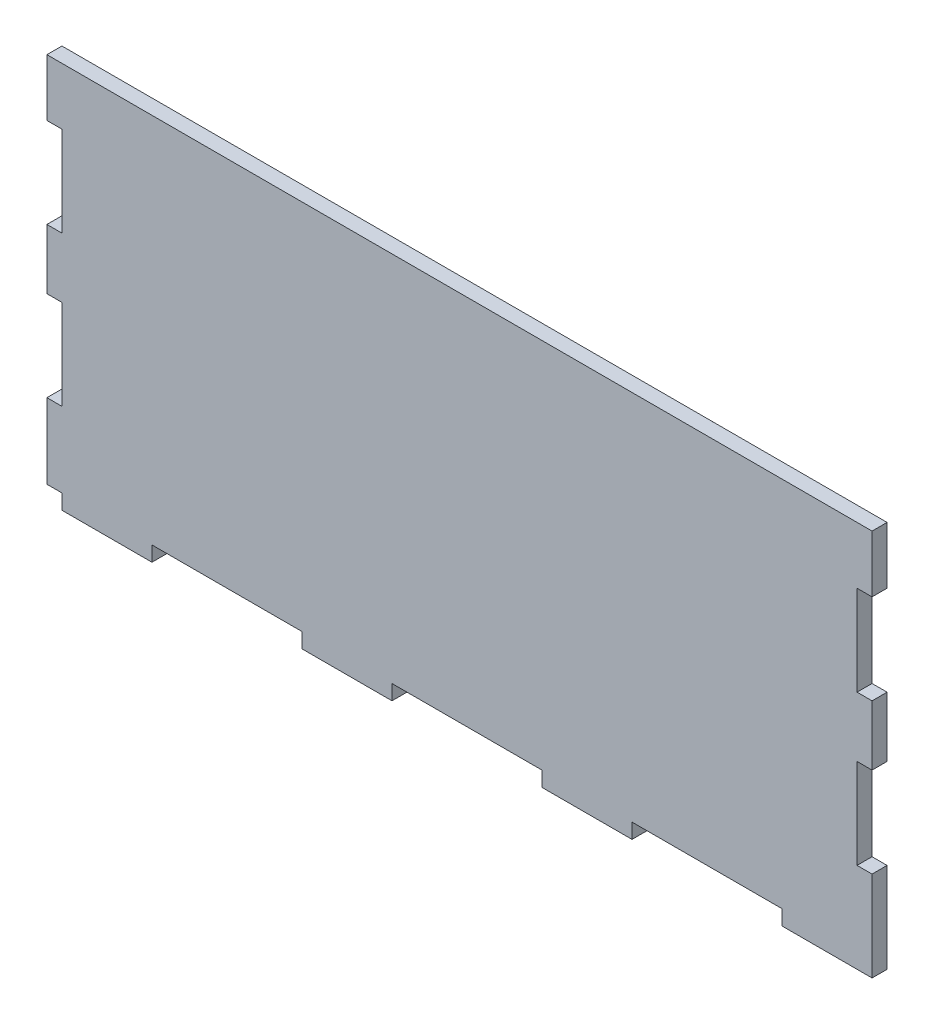
ISO-10303-21;
HEADER;
FILE_DESCRIPTION(('STEP AP214'),'2;1');
FILE_NAME('part.step','',(''),(''),'','','');
FILE_SCHEMA(('AUTOMOTIVE_DESIGN { 1 0 10303 214 1 1 1 1 }'));
ENDSEC;
DATA;
#1=APPLICATION_CONTEXT('core data for automotive mechanical design processes');
#2=APPLICATION_PROTOCOL_DEFINITION('international standard','automotive_design',2000,#1);
#3=PRODUCT_CONTEXT('',#1,'mechanical');
#4=PRODUCT('Part','Part','',(#3));
#5=PRODUCT_RELATED_PRODUCT_CATEGORY('part','',(#4));
#6=PRODUCT_DEFINITION_FORMATION('','',#4);
#7=PRODUCT_DEFINITION_CONTEXT('part definition',#1,'design');
#8=PRODUCT_DEFINITION('design','',#6,#7);
#9=PRODUCT_DEFINITION_SHAPE('','',#8);
#10=(LENGTH_UNIT() NAMED_UNIT(*) SI_UNIT(.MILLI.,.METRE.));
#11=(NAMED_UNIT(*) PLANE_ANGLE_UNIT() SI_UNIT($,.RADIAN.));
#12=(NAMED_UNIT(*) SI_UNIT($,.STERADIAN.) SOLID_ANGLE_UNIT());
#13=UNCERTAINTY_MEASURE_WITH_UNIT(LENGTH_MEASURE(1.E-05),#10,'distance_accuracy_value','');
#14=(GEOMETRIC_REPRESENTATION_CONTEXT(3) GLOBAL_UNCERTAINTY_ASSIGNED_CONTEXT((#13)) GLOBAL_UNIT_ASSIGNED_CONTEXT((#10,
#11,#12)) REPRESENTATION_CONTEXT('',''));
#15=CARTESIAN_POINT('',(0.,0.,0.));
#16=DIRECTION('',(0.,0.,1.));
#17=DIRECTION('',(1.,0.,0.));
#18=AXIS2_PLACEMENT_3D('',#15,#16,#17);
#19=CARTESIAN_POINT('',(180.,0.,5.));
#20=DIRECTION('',(-1.,0.,0.));
#21=DIRECTION('',(0.,0.,1.));
#22=AXIS2_PLACEMENT_3D('',#19,#20,#21);
#23=PLANE('',#22);
#24=DIRECTION('',(0.,1.,0.));
#25=VECTOR('',#24,1.);
#26=CARTESIAN_POINT('',(180.,0.,0.));
#27=LINE('',#26,#25);
#28=CARTESIAN_POINT('',(180.,-49.0000000000001,0.));
#29=VERTEX_POINT('',#28);
#30=CARTESIAN_POINT('',(180.,-19.0000000000001,0.));
#31=VERTEX_POINT('',#30);
#32=EDGE_CURVE('E300',#29,#31,#27,.T.);
#33=ORIENTED_EDGE('',*,*,#32,.F.);
#34=DIRECTION('',(0.,0.,-1.));
#35=VECTOR('',#34,1.);
#36=CARTESIAN_POINT('',(180.,-49.0000000000001,5.));
#37=LINE('',#36,#35);
#38=CARTESIAN_POINT('',(180.,-49.0000000000001,5.));
#39=VERTEX_POINT('',#38);
#40=EDGE_CURVE('E11',#39,#29,#37,.T.);
#41=ORIENTED_EDGE('',*,*,#40,.F.);
#42=DIRECTION('',(0.,1.,0.));
#43=VECTOR('',#42,1.);
#44=CARTESIAN_POINT('',(180.,0.,5.));
#45=LINE('',#44,#43);
#46=CARTESIAN_POINT('',(180.,-19.0000000000001,5.));
#47=VERTEX_POINT('',#46);
#48=EDGE_CURVE('E415',#39,#47,#45,.T.);
#49=ORIENTED_EDGE('',*,*,#48,.T.);
#50=DIRECTION('',(0.,0.,-1.));
#51=VECTOR('',#50,1.);
#52=CARTESIAN_POINT('',(180.,-19.0000000000001,5.));
#53=LINE('',#52,#51);
#54=EDGE_CURVE('E62',#47,#31,#53,.T.);
#55=ORIENTED_EDGE('',*,*,#54,.T.);
#56=EDGE_LOOP('',(#33,#41,#49,#55));
#57=FACE_BOUND('',#56,.T.);
#58=ADVANCED_FACE('F45',(#57),#23,.T.);
#59=CARTESIAN_POINT('',(0.,-49.0000000000001,5.));
#60=DIRECTION('',(0.,-1.,0.));
#61=DIRECTION('',(0.,0.,-1.));
#62=AXIS2_PLACEMENT_3D('',#59,#60,#61);
#63=PLANE('',#62);
#64=DIRECTION('',(-1.,0.,0.));
#65=VECTOR('',#64,1.);
#66=CARTESIAN_POINT('',(0.,-49.0000000000001,0.));
#67=LINE('',#66,#65);
#68=CARTESIAN_POINT('',(175.,-49.0000000000001,0.));
#69=VERTEX_POINT('',#68);
#70=EDGE_CURVE('E303',#29,#69,#67,.T.);
#71=ORIENTED_EDGE('',*,*,#70,.T.);
#72=DIRECTION('',(0.,0.,-1.));
#73=VECTOR('',#72,1.);
#74=CARTESIAN_POINT('',(175.,-49.0000000000001,5.));
#75=LINE('',#74,#73);
#76=CARTESIAN_POINT('',(175.,-49.0000000000001,5.));
#77=VERTEX_POINT('',#76);
#78=EDGE_CURVE('E54',#77,#69,#75,.T.);
#79=ORIENTED_EDGE('',*,*,#78,.F.);
#80=DIRECTION('',(-1.,0.,0.));
#81=VECTOR('',#80,1.);
#82=CARTESIAN_POINT('',(0.,-49.0000000000001,5.));
#83=LINE('',#82,#81);
#84=EDGE_CURVE('E545',#39,#77,#83,.T.);
#85=ORIENTED_EDGE('',*,*,#84,.F.);
#86=ORIENTED_EDGE('',*,*,#40,.T.);
#87=EDGE_LOOP('',(#71,#79,#85,#86));
#88=FACE_BOUND('',#87,.T.);
#89=ADVANCED_FACE('F532',(#88),#63,.F.);
#90=CARTESIAN_POINT('',(175.,0.,5.));
#91=DIRECTION('',(-1.,0.,0.));
#92=DIRECTION('',(0.,0.,1.));
#93=AXIS2_PLACEMENT_3D('',#90,#91,#92);
#94=PLANE('',#93);
#95=DIRECTION('',(0.,1.,0.));
#96=VECTOR('',#95,1.);
#97=CARTESIAN_POINT('',(175.,0.,0.));
#98=LINE('',#97,#96);
#99=CARTESIAN_POINT('',(175.,-69.0000000000001,0.));
#100=VERTEX_POINT('',#99);
#101=EDGE_CURVE('E307',#100,#69,#98,.T.);
#102=ORIENTED_EDGE('',*,*,#101,.F.);
#103=DIRECTION('',(0.,0.,-1.));
#104=VECTOR('',#103,1.);
#105=CARTESIAN_POINT('',(175.,-69.0000000000001,5.));
#106=LINE('',#105,#104);
#107=CARTESIAN_POINT('',(175.,-69.0000000000001,5.));
#108=VERTEX_POINT('',#107);
#109=EDGE_CURVE('E520',#108,#100,#106,.T.);
#110=ORIENTED_EDGE('',*,*,#109,.F.);
#111=DIRECTION('',(0.,1.,0.));
#112=VECTOR('',#111,1.);
#113=CARTESIAN_POINT('',(175.,0.,5.));
#114=LINE('',#113,#112);
#115=EDGE_CURVE('E529',#108,#77,#114,.T.);
#116=ORIENTED_EDGE('',*,*,#115,.T.);
#117=ORIENTED_EDGE('',*,*,#78,.T.);
#118=EDGE_LOOP('',(#102,#110,#116,#117));
#119=FACE_BOUND('',#118,.T.);
#120=ADVANCED_FACE('F527',(#119),#94,.T.);
#121=CARTESIAN_POINT('',(0.,-69.0000000000001,5.));
#122=DIRECTION('',(0.,-1.,0.));
#123=DIRECTION('',(0.,0.,-1.));
#124=AXIS2_PLACEMENT_3D('',#121,#122,#123);
#125=PLANE('',#124);
#126=DIRECTION('',(-1.,0.,0.));
#127=VECTOR('',#126,1.);
#128=CARTESIAN_POINT('',(0.,-69.0000000000001,0.));
#129=LINE('',#128,#127);
#130=CARTESIAN_POINT('',(180.,-69.0000000000001,0.));
#131=VERTEX_POINT('',#130);
#132=EDGE_CURVE('E311',#131,#100,#129,.T.);
#133=ORIENTED_EDGE('',*,*,#132,.F.);
#134=DIRECTION('',(0.,0.,-1.));
#135=VECTOR('',#134,1.);
#136=CARTESIAN_POINT('',(180.,-69.0000000000001,5.));
#137=LINE('',#136,#135);
#138=CARTESIAN_POINT('',(180.,-69.0000000000001,5.));
#139=VERTEX_POINT('',#138);
#140=EDGE_CURVE('E517',#139,#131,#137,.T.);
#141=ORIENTED_EDGE('',*,*,#140,.F.);
#142=DIRECTION('',(-1.,0.,0.));
#143=VECTOR('',#142,1.);
#144=CARTESIAN_POINT('',(0.,-69.0000000000001,5.));
#145=LINE('',#144,#143);
#146=EDGE_CURVE('E542',#139,#108,#145,.T.);
#147=ORIENTED_EDGE('',*,*,#146,.T.);
#148=ORIENTED_EDGE('',*,*,#109,.T.);
#149=EDGE_LOOP('',(#133,#141,#147,#148));
#150=FACE_BOUND('',#149,.T.);
#151=ADVANCED_FACE('F539',(#150),#125,.T.);
#152=CARTESIAN_POINT('',(179.999999999998,4.32986979603806E-12,5.));
#153=DIRECTION('',(-1.,0.,0.));
#154=DIRECTION('',(0.,-1.,0.));
#155=AXIS2_PLACEMENT_3D('',#152,#153,#154);
#156=PLANE('',#155);
#157=DIRECTION('',(0.,1.,0.));
#158=VECTOR('',#157,1.);
#159=CARTESIAN_POINT('',(179.999999999998,4.32986979603806E-12,0.));
#160=LINE('',#159,#158);
#161=CARTESIAN_POINT('',(180.,-99.0000000000001,0.));
#162=VERTEX_POINT('',#161);
#163=EDGE_CURVE('E315',#162,#131,#160,.T.);
#164=ORIENTED_EDGE('',*,*,#163,.F.);
#165=DIRECTION('',(0.,0.,-1.));
#166=VECTOR('',#165,1.);
#167=CARTESIAN_POINT('',(180.,-99.0000000000001,5.));
#168=LINE('',#167,#166);
#169=CARTESIAN_POINT('',(180.,-99.0000000000001,5.));
#170=VERTEX_POINT('',#169);
#171=EDGE_CURVE('E514',#170,#162,#168,.T.);
#172=ORIENTED_EDGE('',*,*,#171,.F.);
#173=DIRECTION('',(0.,1.,0.));
#174=VECTOR('',#173,1.);
#175=CARTESIAN_POINT('',(179.999999999998,4.32986979603806E-12,5.));
#176=LINE('',#175,#174);
#177=EDGE_CURVE('E550',#170,#139,#176,.T.);
#178=ORIENTED_EDGE('',*,*,#177,.T.);
#179=ORIENTED_EDGE('',*,*,#140,.T.);
#180=EDGE_LOOP('',(#164,#172,#178,#179));
#181=FACE_BOUND('',#180,.T.);
#182=ADVANCED_FACE('F662',(#181),#156,.T.);
#183=CARTESIAN_POINT('',(0.,-99.0000000000001,5.));
#184=DIRECTION('',(0.,-1.,0.));
#185=DIRECTION('',(0.,0.,-1.));
#186=AXIS2_PLACEMENT_3D('',#183,#184,#185);
#187=PLANE('',#186);
#188=DIRECTION('',(-1.,0.,0.));
#189=VECTOR('',#188,1.);
#190=CARTESIAN_POINT('',(0.,-99.0000000000001,0.));
#191=LINE('',#190,#189);
#192=CARTESIAN_POINT('',(175.,-99.0000000000001,0.));
#193=VERTEX_POINT('',#192);
#194=EDGE_CURVE('E319',#162,#193,#191,.T.);
#195=ORIENTED_EDGE('',*,*,#194,.T.);
#196=DIRECTION('',(0.,0.,-1.));
#197=VECTOR('',#196,1.);
#198=CARTESIAN_POINT('',(175.,-99.0000000000001,5.));
#199=LINE('',#198,#197);
#200=CARTESIAN_POINT('',(175.,-99.0000000000001,5.));
#201=VERTEX_POINT('',#200);
#202=EDGE_CURVE('E511',#201,#193,#199,.T.);
#203=ORIENTED_EDGE('',*,*,#202,.F.);
#204=DIRECTION('',(-1.,0.,0.));
#205=VECTOR('',#204,1.);
#206=CARTESIAN_POINT('',(0.,-99.0000000000001,5.));
#207=LINE('',#206,#205);
#208=EDGE_CURVE('E557',#170,#201,#207,.T.);
#209=ORIENTED_EDGE('',*,*,#208,.F.);
#210=ORIENTED_EDGE('',*,*,#171,.T.);
#211=EDGE_LOOP('',(#195,#203,#209,#210));
#212=FACE_BOUND('',#211,.T.);
#213=ADVANCED_FACE('F665',(#212),#187,.F.);
#214=CARTESIAN_POINT('',(175.,0.,5.));
#215=DIRECTION('',(-1.,0.,0.));
#216=DIRECTION('',(0.,0.,1.));
#217=AXIS2_PLACEMENT_3D('',#214,#215,#216);
#218=PLANE('',#217);
#219=DIRECTION('',(0.,1.,0.));
#220=VECTOR('',#219,1.);
#221=CARTESIAN_POINT('',(175.,0.,0.));
#222=LINE('',#221,#220);
#223=CARTESIAN_POINT('',(175.,-124.,0.));
#224=VERTEX_POINT('',#223);
#225=EDGE_CURVE('E323',#224,#193,#222,.T.);
#226=ORIENTED_EDGE('',*,*,#225,.F.);
#227=DIRECTION('',(0.,0.,-1.));
#228=VECTOR('',#227,1.);
#229=CARTESIAN_POINT('',(175.,-124.,5.));
#230=LINE('',#229,#228);
#231=CARTESIAN_POINT('',(175.,-124.,5.));
#232=VERTEX_POINT('',#231);
#233=EDGE_CURVE('E508',#232,#224,#230,.T.);
#234=ORIENTED_EDGE('',*,*,#233,.F.);
#235=DIRECTION('',(0.,1.,0.));
#236=VECTOR('',#235,1.);
#237=CARTESIAN_POINT('',(175.,0.,5.));
#238=LINE('',#237,#236);
#239=EDGE_CURVE('E560',#232,#201,#238,.T.);
#240=ORIENTED_EDGE('',*,*,#239,.T.);
#241=ORIENTED_EDGE('',*,*,#202,.T.);
#242=EDGE_LOOP('',(#226,#234,#240,#241));
#243=FACE_BOUND('',#242,.T.);
#244=ADVANCED_FACE('F669',(#243),#218,.T.);
#245=CARTESIAN_POINT('',(-3.44169137633797E-13,-124.,5.));
#246=DIRECTION('',(0.,-1.,0.));
#247=DIRECTION('',(1.,0.,0.));
#248=AXIS2_PLACEMENT_3D('',#245,#246,#247);
#249=PLANE('',#248);
#250=DIRECTION('',(-1.,0.,0.));
#251=VECTOR('',#250,1.);
#252=CARTESIAN_POINT('',(-3.44169137633797E-13,-124.,0.));
#253=LINE('',#252,#251);
#254=CARTESIAN_POINT('',(180.,-124.,0.));
#255=VERTEX_POINT('',#254);
#256=EDGE_CURVE('E327',#255,#224,#253,.T.);
#257=ORIENTED_EDGE('',*,*,#256,.F.);
#258=DIRECTION('',(0.,0.,-1.));
#259=VECTOR('',#258,1.);
#260=CARTESIAN_POINT('',(180.,-124.,5.));
#261=LINE('',#260,#259);
#262=CARTESIAN_POINT('',(180.,-124.,5.));
#263=VERTEX_POINT('',#262);
#264=EDGE_CURVE('E505',#263,#255,#261,.T.);
#265=ORIENTED_EDGE('',*,*,#264,.F.);
#266=DIRECTION('',(-1.,0.,0.));
#267=VECTOR('',#266,1.);
#268=CARTESIAN_POINT('',(-3.44169137633797E-13,-124.,5.));
#269=LINE('',#268,#267);
#270=EDGE_CURVE('E564',#263,#232,#269,.T.);
#271=ORIENTED_EDGE('',*,*,#270,.T.);
#272=ORIENTED_EDGE('',*,*,#233,.T.);
#273=EDGE_LOOP('',(#257,#265,#271,#272));
#274=FACE_BOUND('',#273,.T.);
#275=ADVANCED_FACE('F673',(#274),#249,.T.);
#276=CARTESIAN_POINT('',(180.,0.,5.));
#277=DIRECTION('',(1.,0.,0.));
#278=DIRECTION('',(0.,0.,-1.));
#279=AXIS2_PLACEMENT_3D('',#276,#277,#278);
#280=PLANE('',#279);
#281=DIRECTION('',(0.,-1.,0.));
#282=VECTOR('',#281,1.);
#283=CARTESIAN_POINT('',(180.,0.,0.));
#284=LINE('',#283,#282);
#285=CARTESIAN_POINT('',(180.,-129.,0.));
#286=VERTEX_POINT('',#285);
#287=EDGE_CURVE('E331',#255,#286,#284,.T.);
#288=ORIENTED_EDGE('',*,*,#287,.T.);
#289=DIRECTION('',(0.,0.,-1.));
#290=VECTOR('',#289,1.);
#291=CARTESIAN_POINT('',(180.,-129.,5.));
#292=LINE('',#291,#290);
#293=CARTESIAN_POINT('',(180.,-129.,5.));
#294=VERTEX_POINT('',#293);
#295=EDGE_CURVE('E501',#294,#286,#292,.T.);
#296=ORIENTED_EDGE('',*,*,#295,.F.);
#297=DIRECTION('',(0.,-1.,0.));
#298=VECTOR('',#297,1.);
#299=CARTESIAN_POINT('',(180.,0.,5.));
#300=LINE('',#299,#298);
#301=EDGE_CURVE('E568',#263,#294,#300,.T.);
#302=ORIENTED_EDGE('',*,*,#301,.F.);
#303=ORIENTED_EDGE('',*,*,#264,.T.);
#304=EDGE_LOOP('',(#288,#296,#302,#303));
#305=FACE_BOUND('',#304,.T.);
#306=ADVANCED_FACE('F677',(#305),#280,.F.);
#307=CARTESIAN_POINT('',(0.,-129.,5.));
#308=DIRECTION('',(0.,1.,0.));
#309=DIRECTION('',(0.,0.,1.));
#310=AXIS2_PLACEMENT_3D('',#307,#308,#309);
#311=PLANE('',#310);
#312=DIRECTION('',(1.,0.,0.));
#313=VECTOR('',#312,1.);
#314=CARTESIAN_POINT('',(0.,-129.,0.));
#315=LINE('',#314,#313);
#316=CARTESIAN_POINT('',(210.,-129.,0.));
#317=VERTEX_POINT('',#316);
#318=EDGE_CURVE('E334',#286,#317,#315,.T.);
#319=ORIENTED_EDGE('',*,*,#318,.T.);
#320=DIRECTION('',(0.,0.,-1.));
#321=VECTOR('',#320,1.);
#322=CARTESIAN_POINT('',(210.,-129.,5.));
#323=LINE('',#322,#321);
#324=CARTESIAN_POINT('',(210.,-129.,5.));
#325=VERTEX_POINT('',#324);
#326=EDGE_CURVE('E497',#325,#317,#323,.T.);
#327=ORIENTED_EDGE('',*,*,#326,.F.);
#328=DIRECTION('',(1.,0.,0.));
#329=VECTOR('',#328,1.);
#330=CARTESIAN_POINT('',(0.,-129.,5.));
#331=LINE('',#330,#329);
#332=EDGE_CURVE('E571',#294,#325,#331,.T.);
#333=ORIENTED_EDGE('',*,*,#332,.F.);
#334=ORIENTED_EDGE('',*,*,#295,.T.);
#335=EDGE_LOOP('',(#319,#327,#333,#334));
#336=FACE_BOUND('',#335,.T.);
#337=ADVANCED_FACE('F681',(#336),#311,.F.);
#338=CARTESIAN_POINT('',(210.,0.,5.));
#339=DIRECTION('',(-1.,0.,0.));
#340=DIRECTION('',(0.,0.,1.));
#341=AXIS2_PLACEMENT_3D('',#338,#339,#340);
#342=PLANE('',#341);
#343=DIRECTION('',(0.,1.,0.));
#344=VECTOR('',#343,1.);
#345=CARTESIAN_POINT('',(210.,0.,0.));
#346=LINE('',#345,#344);
#347=CARTESIAN_POINT('',(210.,-124.,0.));
#348=VERTEX_POINT('',#347);
#349=EDGE_CURVE('E337',#317,#348,#346,.T.);
#350=ORIENTED_EDGE('',*,*,#349,.T.);
#351=DIRECTION('',(0.,0.,-1.));
#352=VECTOR('',#351,1.);
#353=CARTESIAN_POINT('',(210.,-124.,5.));
#354=LINE('',#353,#352);
#355=CARTESIAN_POINT('',(210.,-124.,5.));
#356=VERTEX_POINT('',#355);
#357=EDGE_CURVE('E493',#356,#348,#354,.T.);
#358=ORIENTED_EDGE('',*,*,#357,.F.);
#359=DIRECTION('',(0.,1.,0.));
#360=VECTOR('',#359,1.);
#361=CARTESIAN_POINT('',(210.,0.,5.));
#362=LINE('',#361,#360);
#363=EDGE_CURVE('E574',#325,#356,#362,.T.);
#364=ORIENTED_EDGE('',*,*,#363,.F.);
#365=ORIENTED_EDGE('',*,*,#326,.T.);
#366=EDGE_LOOP('',(#350,#358,#364,#365));
#367=FACE_BOUND('',#366,.T.);
#368=ADVANCED_FACE('F685',(#367),#342,.F.);
#369=CARTESIAN_POINT('',(0.,-124.,5.));
#370=DIRECTION('',(0.,1.,0.));
#371=DIRECTION('',(0.,0.,1.));
#372=AXIS2_PLACEMENT_3D('',#369,#370,#371);
#373=PLANE('',#372);
#374=DIRECTION('',(1.,0.,0.));
#375=VECTOR('',#374,1.);
#376=CARTESIAN_POINT('',(0.,-124.,0.));
#377=LINE('',#376,#375);
#378=CARTESIAN_POINT('',(260.,-124.,0.));
#379=VERTEX_POINT('',#378);
#380=EDGE_CURVE('E340',#348,#379,#377,.T.);
#381=ORIENTED_EDGE('',*,*,#380,.T.);
#382=DIRECTION('',(0.,0.,-1.));
#383=VECTOR('',#382,1.);
#384=CARTESIAN_POINT('',(260.,-124.,5.));
#385=LINE('',#384,#383);
#386=CARTESIAN_POINT('',(260.,-124.,5.));
#387=VERTEX_POINT('',#386);
#388=EDGE_CURVE('E489',#387,#379,#385,.T.);
#389=ORIENTED_EDGE('',*,*,#388,.F.);
#390=DIRECTION('',(1.,0.,0.));
#391=VECTOR('',#390,1.);
#392=CARTESIAN_POINT('',(0.,-124.,5.));
#393=LINE('',#392,#391);
#394=EDGE_CURVE('E577',#356,#387,#393,.T.);
#395=ORIENTED_EDGE('',*,*,#394,.F.);
#396=ORIENTED_EDGE('',*,*,#357,.T.);
#397=EDGE_LOOP('',(#381,#389,#395,#396));
#398=FACE_BOUND('',#397,.T.);
#399=ADVANCED_FACE('F689',(#398),#373,.F.);
#400=CARTESIAN_POINT('',(260.,0.,5.));
#401=DIRECTION('',(1.,0.,0.));
#402=DIRECTION('',(0.,0.,-1.));
#403=AXIS2_PLACEMENT_3D('',#400,#401,#402);
#404=PLANE('',#403);
#405=DIRECTION('',(0.,-1.,0.));
#406=VECTOR('',#405,1.);
#407=CARTESIAN_POINT('',(260.,0.,0.));
#408=LINE('',#407,#406);
#409=CARTESIAN_POINT('',(260.,-129.,0.));
#410=VERTEX_POINT('',#409);
#411=EDGE_CURVE('E343',#379,#410,#408,.T.);
#412=ORIENTED_EDGE('',*,*,#411,.T.);
#413=DIRECTION('',(0.,0.,-1.));
#414=VECTOR('',#413,1.);
#415=CARTESIAN_POINT('',(260.,-129.,5.));
#416=LINE('',#415,#414);
#417=CARTESIAN_POINT('',(260.,-129.,5.));
#418=VERTEX_POINT('',#417);
#419=EDGE_CURVE('E485',#418,#410,#416,.T.);
#420=ORIENTED_EDGE('',*,*,#419,.F.);
#421=DIRECTION('',(0.,-1.,0.));
#422=VECTOR('',#421,1.);
#423=CARTESIAN_POINT('',(260.,0.,5.));
#424=LINE('',#423,#422);
#425=EDGE_CURVE('E580',#387,#418,#424,.T.);
#426=ORIENTED_EDGE('',*,*,#425,.F.);
#427=ORIENTED_EDGE('',*,*,#388,.T.);
#428=EDGE_LOOP('',(#412,#420,#426,#427));
#429=FACE_BOUND('',#428,.T.);
#430=ADVANCED_FACE('F693',(#429),#404,.F.);
#431=CARTESIAN_POINT('',(0.,-129.,5.));
#432=DIRECTION('',(0.,1.,0.));
#433=DIRECTION('',(0.,0.,1.));
#434=AXIS2_PLACEMENT_3D('',#431,#432,#433);
#435=PLANE('',#434);
#436=DIRECTION('',(1.,0.,0.));
#437=VECTOR('',#436,1.);
#438=CARTESIAN_POINT('',(0.,-129.,0.));
#439=LINE('',#438,#437);
#440=CARTESIAN_POINT('',(290.,-129.,0.));
#441=VERTEX_POINT('',#440);
#442=EDGE_CURVE('E346',#410,#441,#439,.T.);
#443=ORIENTED_EDGE('',*,*,#442,.T.);
#444=DIRECTION('',(0.,0.,-1.));
#445=VECTOR('',#444,1.);
#446=CARTESIAN_POINT('',(290.,-129.,5.));
#447=LINE('',#446,#445);
#448=CARTESIAN_POINT('',(290.,-129.,5.));
#449=VERTEX_POINT('',#448);
#450=EDGE_CURVE('E481',#449,#441,#447,.T.);
#451=ORIENTED_EDGE('',*,*,#450,.F.);
#452=DIRECTION('',(1.,0.,0.));
#453=VECTOR('',#452,1.);
#454=CARTESIAN_POINT('',(0.,-129.,5.));
#455=LINE('',#454,#453);
#456=EDGE_CURVE('E583',#418,#449,#455,.T.);
#457=ORIENTED_EDGE('',*,*,#456,.F.);
#458=ORIENTED_EDGE('',*,*,#419,.T.);
#459=EDGE_LOOP('',(#443,#451,#457,#458));
#460=FACE_BOUND('',#459,.T.);
#461=ADVANCED_FACE('F697',(#460),#435,.F.);
#462=CARTESIAN_POINT('',(290.,0.,5.));
#463=DIRECTION('',(-1.,0.,0.));
#464=DIRECTION('',(0.,0.,1.));
#465=AXIS2_PLACEMENT_3D('',#462,#463,#464);
#466=PLANE('',#465);
#467=DIRECTION('',(0.,1.,0.));
#468=VECTOR('',#467,1.);
#469=CARTESIAN_POINT('',(290.,0.,0.));
#470=LINE('',#469,#468);
#471=CARTESIAN_POINT('',(290.,-124.,0.));
#472=VERTEX_POINT('',#471);
#473=EDGE_CURVE('E349',#441,#472,#470,.T.);
#474=ORIENTED_EDGE('',*,*,#473,.T.);
#475=DIRECTION('',(0.,0.,-1.));
#476=VECTOR('',#475,1.);
#477=CARTESIAN_POINT('',(290.,-124.,5.));
#478=LINE('',#477,#476);
#479=CARTESIAN_POINT('',(290.,-124.,5.));
#480=VERTEX_POINT('',#479);
#481=EDGE_CURVE('E477',#480,#472,#478,.T.);
#482=ORIENTED_EDGE('',*,*,#481,.F.);
#483=DIRECTION('',(0.,1.,0.));
#484=VECTOR('',#483,1.);
#485=CARTESIAN_POINT('',(290.,0.,5.));
#486=LINE('',#485,#484);
#487=EDGE_CURVE('E586',#449,#480,#486,.T.);
#488=ORIENTED_EDGE('',*,*,#487,.F.);
#489=ORIENTED_EDGE('',*,*,#450,.T.);
#490=EDGE_LOOP('',(#474,#482,#488,#489));
#491=FACE_BOUND('',#490,.T.);
#492=ADVANCED_FACE('F701',(#491),#466,.F.);
#493=CARTESIAN_POINT('',(0.,-124.,5.));
#494=DIRECTION('',(0.,1.,0.));
#495=DIRECTION('',(0.,0.,1.));
#496=AXIS2_PLACEMENT_3D('',#493,#494,#495);
#497=PLANE('',#496);
#498=DIRECTION('',(1.,0.,0.));
#499=VECTOR('',#498,1.);
#500=CARTESIAN_POINT('',(0.,-124.,0.));
#501=LINE('',#500,#499);
#502=CARTESIAN_POINT('',(340.,-124.,0.));
#503=VERTEX_POINT('',#502);
#504=EDGE_CURVE('E352',#472,#503,#501,.T.);
#505=ORIENTED_EDGE('',*,*,#504,.T.);
#506=DIRECTION('',(0.,0.,-1.));
#507=VECTOR('',#506,1.);
#508=CARTESIAN_POINT('',(340.,-124.,5.));
#509=LINE('',#508,#507);
#510=CARTESIAN_POINT('',(340.,-124.,5.));
#511=VERTEX_POINT('',#510);
#512=EDGE_CURVE('E473',#511,#503,#509,.T.);
#513=ORIENTED_EDGE('',*,*,#512,.F.);
#514=DIRECTION('',(1.,0.,0.));
#515=VECTOR('',#514,1.);
#516=CARTESIAN_POINT('',(0.,-124.,5.));
#517=LINE('',#516,#515);
#518=EDGE_CURVE('E589',#480,#511,#517,.T.);
#519=ORIENTED_EDGE('',*,*,#518,.F.);
#520=ORIENTED_EDGE('',*,*,#481,.T.);
#521=EDGE_LOOP('',(#505,#513,#519,#520));
#522=FACE_BOUND('',#521,.T.);
#523=ADVANCED_FACE('F705',(#522),#497,.F.);
#524=CARTESIAN_POINT('',(340.,0.,5.));
#525=DIRECTION('',(1.,0.,0.));
#526=DIRECTION('',(0.,0.,-1.));
#527=AXIS2_PLACEMENT_3D('',#524,#525,#526);
#528=PLANE('',#527);
#529=DIRECTION('',(0.,-1.,0.));
#530=VECTOR('',#529,1.);
#531=CARTESIAN_POINT('',(340.,0.,0.));
#532=LINE('',#531,#530);
#533=CARTESIAN_POINT('',(340.,-129.,0.));
#534=VERTEX_POINT('',#533);
#535=EDGE_CURVE('E355',#503,#534,#532,.T.);
#536=ORIENTED_EDGE('',*,*,#535,.T.);
#537=DIRECTION('',(0.,0.,-1.));
#538=VECTOR('',#537,1.);
#539=CARTESIAN_POINT('',(340.,-129.,5.));
#540=LINE('',#539,#538);
#541=CARTESIAN_POINT('',(340.,-129.,5.));
#542=VERTEX_POINT('',#541);
#543=EDGE_CURVE('E469',#542,#534,#540,.T.);
#544=ORIENTED_EDGE('',*,*,#543,.F.);
#545=DIRECTION('',(0.,-1.,0.));
#546=VECTOR('',#545,1.);
#547=CARTESIAN_POINT('',(340.,0.,5.));
#548=LINE('',#547,#546);
#549=EDGE_CURVE('E592',#511,#542,#548,.T.);
#550=ORIENTED_EDGE('',*,*,#549,.F.);
#551=ORIENTED_EDGE('',*,*,#512,.T.);
#552=EDGE_LOOP('',(#536,#544,#550,#551));
#553=FACE_BOUND('',#552,.T.);
#554=ADVANCED_FACE('F709',(#553),#528,.F.);
#555=CARTESIAN_POINT('',(0.,-129.,5.));
#556=DIRECTION('',(0.,1.,0.));
#557=DIRECTION('',(0.,0.,1.));
#558=AXIS2_PLACEMENT_3D('',#555,#556,#557);
#559=PLANE('',#558);
#560=DIRECTION('',(1.,0.,0.));
#561=VECTOR('',#560,1.);
#562=CARTESIAN_POINT('',(0.,-129.,0.));
#563=LINE('',#562,#561);
#564=CARTESIAN_POINT('',(370.,-129.,0.));
#565=VERTEX_POINT('',#564);
#566=EDGE_CURVE('E358',#534,#565,#563,.T.);
#567=ORIENTED_EDGE('',*,*,#566,.T.);
#568=DIRECTION('',(0.,0.,-1.));
#569=VECTOR('',#568,1.);
#570=CARTESIAN_POINT('',(370.,-129.,5.));
#571=LINE('',#570,#569);
#572=CARTESIAN_POINT('',(370.,-129.,5.));
#573=VERTEX_POINT('',#572);
#574=EDGE_CURVE('E465',#573,#565,#571,.T.);
#575=ORIENTED_EDGE('',*,*,#574,.F.);
#576=DIRECTION('',(1.,0.,0.));
#577=VECTOR('',#576,1.);
#578=CARTESIAN_POINT('',(0.,-129.,5.));
#579=LINE('',#578,#577);
#580=EDGE_CURVE('E595',#542,#573,#579,.T.);
#581=ORIENTED_EDGE('',*,*,#580,.F.);
#582=ORIENTED_EDGE('',*,*,#543,.T.);
#583=EDGE_LOOP('',(#567,#575,#581,#582));
#584=FACE_BOUND('',#583,.T.);
#585=ADVANCED_FACE('F713',(#584),#559,.F.);
#586=CARTESIAN_POINT('',(370.,0.,5.));
#587=DIRECTION('',(-1.,0.,0.));
#588=DIRECTION('',(0.,0.,1.));
#589=AXIS2_PLACEMENT_3D('',#586,#587,#588);
#590=PLANE('',#589);
#591=DIRECTION('',(0.,1.,0.));
#592=VECTOR('',#591,1.);
#593=CARTESIAN_POINT('',(370.,0.,0.));
#594=LINE('',#593,#592);
#595=CARTESIAN_POINT('',(370.,-124.,0.));
#596=VERTEX_POINT('',#595);
#597=EDGE_CURVE('E361',#565,#596,#594,.T.);
#598=ORIENTED_EDGE('',*,*,#597,.T.);
#599=DIRECTION('',(0.,0.,-1.));
#600=VECTOR('',#599,1.);
#601=CARTESIAN_POINT('',(370.,-124.,5.));
#602=LINE('',#601,#600);
#603=CARTESIAN_POINT('',(370.,-124.,5.));
#604=VERTEX_POINT('',#603);
#605=EDGE_CURVE('E461',#604,#596,#602,.T.);
#606=ORIENTED_EDGE('',*,*,#605,.F.);
#607=DIRECTION('',(0.,1.,0.));
#608=VECTOR('',#607,1.);
#609=CARTESIAN_POINT('',(370.,0.,5.));
#610=LINE('',#609,#608);
#611=EDGE_CURVE('E598',#573,#604,#610,.T.);
#612=ORIENTED_EDGE('',*,*,#611,.F.);
#613=ORIENTED_EDGE('',*,*,#574,.T.);
#614=EDGE_LOOP('',(#598,#606,#612,#613));
#615=FACE_BOUND('',#614,.T.);
#616=ADVANCED_FACE('F717',(#615),#590,.F.);
#617=CARTESIAN_POINT('',(0.,-124.,5.));
#618=DIRECTION('',(0.,1.,0.));
#619=DIRECTION('',(0.,0.,1.));
#620=AXIS2_PLACEMENT_3D('',#617,#618,#619);
#621=PLANE('',#620);
#622=DIRECTION('',(1.,0.,0.));
#623=VECTOR('',#622,1.);
#624=CARTESIAN_POINT('',(0.,-124.,0.));
#625=LINE('',#624,#623);
#626=CARTESIAN_POINT('',(420.,-124.,0.));
#627=VERTEX_POINT('',#626);
#628=EDGE_CURVE('E364',#596,#627,#625,.T.);
#629=ORIENTED_EDGE('',*,*,#628,.T.);
#630=DIRECTION('',(0.,0.,-1.));
#631=VECTOR('',#630,1.);
#632=CARTESIAN_POINT('',(420.,-124.,5.));
#633=LINE('',#632,#631);
#634=CARTESIAN_POINT('',(420.,-124.,5.));
#635=VERTEX_POINT('',#634);
#636=EDGE_CURVE('E457',#635,#627,#633,.T.);
#637=ORIENTED_EDGE('',*,*,#636,.F.);
#638=DIRECTION('',(1.,0.,0.));
#639=VECTOR('',#638,1.);
#640=CARTESIAN_POINT('',(0.,-124.,5.));
#641=LINE('',#640,#639);
#642=EDGE_CURVE('E601',#604,#635,#641,.T.);
#643=ORIENTED_EDGE('',*,*,#642,.F.);
#644=ORIENTED_EDGE('',*,*,#605,.T.);
#645=EDGE_LOOP('',(#629,#637,#643,#644));
#646=FACE_BOUND('',#645,.T.);
#647=ADVANCED_FACE('F721',(#646),#621,.F.);
#648=CARTESIAN_POINT('',(420.,0.,5.));
#649=DIRECTION('',(1.,0.,0.));
#650=DIRECTION('',(0.,0.,-1.));
#651=AXIS2_PLACEMENT_3D('',#648,#649,#650);
#652=PLANE('',#651);
#653=DIRECTION('',(0.,-1.,0.));
#654=VECTOR('',#653,1.);
#655=CARTESIAN_POINT('',(420.,0.,0.));
#656=LINE('',#655,#654);
#657=CARTESIAN_POINT('',(420.,-129.,0.));
#658=VERTEX_POINT('',#657);
#659=EDGE_CURVE('E367',#627,#658,#656,.T.);
#660=ORIENTED_EDGE('',*,*,#659,.T.);
#661=DIRECTION('',(0.,0.,-1.));
#662=VECTOR('',#661,1.);
#663=CARTESIAN_POINT('',(420.,-129.,5.));
#664=LINE('',#663,#662);
#665=CARTESIAN_POINT('',(420.,-129.,5.));
#666=VERTEX_POINT('',#665);
#667=EDGE_CURVE('E453',#666,#658,#664,.T.);
#668=ORIENTED_EDGE('',*,*,#667,.F.);
#669=DIRECTION('',(0.,-1.,0.));
#670=VECTOR('',#669,1.);
#671=CARTESIAN_POINT('',(420.,0.,5.));
#672=LINE('',#671,#670);
#673=EDGE_CURVE('E604',#635,#666,#672,.T.);
#674=ORIENTED_EDGE('',*,*,#673,.F.);
#675=ORIENTED_EDGE('',*,*,#636,.T.);
#676=EDGE_LOOP('',(#660,#668,#674,#675));
#677=FACE_BOUND('',#676,.T.);
#678=ADVANCED_FACE('F725',(#677),#652,.F.);
#679=CARTESIAN_POINT('',(0.,-129.,5.));
#680=DIRECTION('',(0.,1.,0.));
#681=DIRECTION('',(0.,0.,1.));
#682=AXIS2_PLACEMENT_3D('',#679,#680,#681);
#683=PLANE('',#682);
#684=DIRECTION('',(1.,0.,0.));
#685=VECTOR('',#684,1.);
#686=CARTESIAN_POINT('',(0.,-129.,0.));
#687=LINE('',#686,#685);
#688=CARTESIAN_POINT('',(450.,-129.,0.));
#689=VERTEX_POINT('',#688);
#690=EDGE_CURVE('E370',#658,#689,#687,.T.);
#691=ORIENTED_EDGE('',*,*,#690,.T.);
#692=DIRECTION('',(0.,0.,-1.));
#693=VECTOR('',#692,1.);
#694=CARTESIAN_POINT('',(450.,-129.,5.));
#695=LINE('',#694,#693);
#696=CARTESIAN_POINT('',(450.,-129.,5.));
#697=VERTEX_POINT('',#696);
#698=EDGE_CURVE('E449',#697,#689,#695,.T.);
#699=ORIENTED_EDGE('',*,*,#698,.F.);
#700=DIRECTION('',(1.,0.,0.));
#701=VECTOR('',#700,1.);
#702=CARTESIAN_POINT('',(0.,-129.,5.));
#703=LINE('',#702,#701);
#704=EDGE_CURVE('E607',#666,#697,#703,.T.);
#705=ORIENTED_EDGE('',*,*,#704,.F.);
#706=ORIENTED_EDGE('',*,*,#667,.T.);
#707=EDGE_LOOP('',(#691,#699,#705,#706));
#708=FACE_BOUND('',#707,.T.);
#709=ADVANCED_FACE('F729',(#708),#683,.F.);
#710=CARTESIAN_POINT('',(450.,0.,5.));
#711=DIRECTION('',(-1.,0.,0.));
#712=DIRECTION('',(0.,0.,1.));
#713=AXIS2_PLACEMENT_3D('',#710,#711,#712);
#714=PLANE('',#713);
#715=DIRECTION('',(0.,1.,0.));
#716=VECTOR('',#715,1.);
#717=CARTESIAN_POINT('',(450.,0.,0.));
#718=LINE('',#717,#716);
#719=CARTESIAN_POINT('',(449.999999999994,-99.0000000000001,0.));
#720=VERTEX_POINT('',#719);
#721=EDGE_CURVE('E373',#689,#720,#718,.T.);
#722=ORIENTED_EDGE('',*,*,#721,.T.);
#723=DIRECTION('',(0.,0.,-1.));
#724=VECTOR('',#723,1.);
#725=CARTESIAN_POINT('',(449.999999999994,-99.0000000000001,5.));
#726=LINE('',#725,#724);
#727=CARTESIAN_POINT('',(449.999999999994,-99.0000000000001,5.));
#728=VERTEX_POINT('',#727);
#729=EDGE_CURVE('E445',#728,#720,#726,.T.);
#730=ORIENTED_EDGE('',*,*,#729,.F.);
#731=DIRECTION('',(0.,1.,0.));
#732=VECTOR('',#731,1.);
#733=CARTESIAN_POINT('',(450.,0.,5.));
#734=LINE('',#733,#732);
#735=EDGE_CURVE('E610',#697,#728,#734,.T.);
#736=ORIENTED_EDGE('',*,*,#735,.F.);
#737=ORIENTED_EDGE('',*,*,#698,.T.);
#738=EDGE_LOOP('',(#722,#730,#736,#737));
#739=FACE_BOUND('',#738,.T.);
#740=ADVANCED_FACE('F733',(#739),#714,.F.);
#741=CARTESIAN_POINT('',(0.,-99.0000000000001,5.));
#742=DIRECTION('',(0.,-1.,0.));
#743=DIRECTION('',(0.,0.,-1.));
#744=AXIS2_PLACEMENT_3D('',#741,#742,#743);
#745=PLANE('',#744);
#746=DIRECTION('',(-1.,0.,0.));
#747=VECTOR('',#746,1.);
#748=CARTESIAN_POINT('',(0.,-99.0000000000001,0.));
#749=LINE('',#748,#747);
#750=CARTESIAN_POINT('',(444.999999999994,-99.0000000000001,0.));
#751=VERTEX_POINT('',#750);
#752=EDGE_CURVE('E376',#720,#751,#749,.T.);
#753=ORIENTED_EDGE('',*,*,#752,.T.);
#754=DIRECTION('',(0.,0.,-1.));
#755=VECTOR('',#754,1.);
#756=CARTESIAN_POINT('',(444.999999999994,-99.0000000000001,5.));
#757=LINE('',#756,#755);
#758=CARTESIAN_POINT('',(444.999999999994,-99.0000000000001,5.));
#759=VERTEX_POINT('',#758);
#760=EDGE_CURVE('E441',#759,#751,#757,.T.);
#761=ORIENTED_EDGE('',*,*,#760,.F.);
#762=DIRECTION('',(-1.,0.,0.));
#763=VECTOR('',#762,1.);
#764=CARTESIAN_POINT('',(0.,-99.0000000000001,5.));
#765=LINE('',#764,#763);
#766=EDGE_CURVE('E613',#728,#759,#765,.T.);
#767=ORIENTED_EDGE('',*,*,#766,.F.);
#768=ORIENTED_EDGE('',*,*,#729,.T.);
#769=EDGE_LOOP('',(#753,#761,#767,#768));
#770=FACE_BOUND('',#769,.T.);
#771=ADVANCED_FACE('F737',(#770),#745,.F.);
#772=CARTESIAN_POINT('',(444.999999999994,0.,5.));
#773=DIRECTION('',(-1.,0.,0.));
#774=DIRECTION('',(0.,0.,1.));
#775=AXIS2_PLACEMENT_3D('',#772,#773,#774);
#776=PLANE('',#775);
#777=DIRECTION('',(0.,1.,0.));
#778=VECTOR('',#777,1.);
#779=CARTESIAN_POINT('',(444.999999999994,0.,0.));
#780=LINE('',#779,#778);
#781=CARTESIAN_POINT('',(444.999999999994,-69.0000000000001,0.));
#782=VERTEX_POINT('',#781);
#783=EDGE_CURVE('E379',#751,#782,#780,.T.);
#784=ORIENTED_EDGE('',*,*,#783,.T.);
#785=DIRECTION('',(0.,0.,-1.));
#786=VECTOR('',#785,1.);
#787=CARTESIAN_POINT('',(444.999999999994,-69.0000000000001,5.));
#788=LINE('',#787,#786);
#789=CARTESIAN_POINT('',(444.999999999994,-69.0000000000001,5.));
#790=VERTEX_POINT('',#789);
#791=EDGE_CURVE('E438',#790,#782,#788,.T.);
#792=ORIENTED_EDGE('',*,*,#791,.F.);
#793=DIRECTION('',(0.,1.,0.));
#794=VECTOR('',#793,1.);
#795=CARTESIAN_POINT('',(444.999999999994,0.,5.));
#796=LINE('',#795,#794);
#797=EDGE_CURVE('E616',#759,#790,#796,.T.);
#798=ORIENTED_EDGE('',*,*,#797,.F.);
#799=ORIENTED_EDGE('',*,*,#760,.T.);
#800=EDGE_LOOP('',(#784,#792,#798,#799));
#801=FACE_BOUND('',#800,.T.);
#802=ADVANCED_FACE('F741',(#801),#776,.F.);
#803=CARTESIAN_POINT('',(0.,-69.0000000000001,5.));
#804=DIRECTION('',(0.,-1.,0.));
#805=DIRECTION('',(0.,0.,-1.));
#806=AXIS2_PLACEMENT_3D('',#803,#804,#805);
#807=PLANE('',#806);
#808=DIRECTION('',(-1.,0.,0.));
#809=VECTOR('',#808,1.);
#810=CARTESIAN_POINT('',(0.,-69.0000000000001,0.));
#811=LINE('',#810,#809);
#812=CARTESIAN_POINT('',(449.999999999994,-69.0000000000001,0.));
#813=VERTEX_POINT('',#812);
#814=EDGE_CURVE('E383',#813,#782,#811,.T.);
#815=ORIENTED_EDGE('',*,*,#814,.F.);
#816=DIRECTION('',(0.,0.,-1.));
#817=VECTOR('',#816,1.);
#818=CARTESIAN_POINT('',(449.999999999994,-69.0000000000001,5.));
#819=LINE('',#818,#817);
#820=CARTESIAN_POINT('',(449.999999999994,-69.0000000000001,5.));
#821=VERTEX_POINT('',#820);
#822=EDGE_CURVE('E435',#821,#813,#819,.T.);
#823=ORIENTED_EDGE('',*,*,#822,.F.);
#824=DIRECTION('',(-1.,0.,0.));
#825=VECTOR('',#824,1.);
#826=CARTESIAN_POINT('',(0.,-69.0000000000001,5.));
#827=LINE('',#826,#825);
#828=EDGE_CURVE('E619',#821,#790,#827,.T.);
#829=ORIENTED_EDGE('',*,*,#828,.T.);
#830=ORIENTED_EDGE('',*,*,#791,.T.);
#831=EDGE_LOOP('',(#815,#823,#829,#830));
#832=FACE_BOUND('',#831,.T.);
#833=ADVANCED_FACE('F745',(#832),#807,.T.);
#834=CARTESIAN_POINT('',(449.999999999994,0.,5.));
#835=DIRECTION('',(1.,0.,0.));
#836=DIRECTION('',(0.,0.,-1.));
#837=AXIS2_PLACEMENT_3D('',#834,#835,#836);
#838=PLANE('',#837);
#839=DIRECTION('',(0.,-1.,0.));
#840=VECTOR('',#839,1.);
#841=CARTESIAN_POINT('',(449.999999999994,0.,0.));
#842=LINE('',#841,#840);
#843=CARTESIAN_POINT('',(449.999999999994,-49.0000000000001,0.));
#844=VERTEX_POINT('',#843);
#845=EDGE_CURVE('E387',#844,#813,#842,.T.);
#846=ORIENTED_EDGE('',*,*,#845,.F.);
#847=DIRECTION('',(0.,0.,-1.));
#848=VECTOR('',#847,1.);
#849=CARTESIAN_POINT('',(449.999999999994,-49.0000000000001,5.));
#850=LINE('',#849,#848);
#851=CARTESIAN_POINT('',(449.999999999994,-49.0000000000001,5.));
#852=VERTEX_POINT('',#851);
#853=EDGE_CURVE('E432',#852,#844,#850,.T.);
#854=ORIENTED_EDGE('',*,*,#853,.F.);
#855=DIRECTION('',(0.,-1.,0.));
#856=VECTOR('',#855,1.);
#857=CARTESIAN_POINT('',(449.999999999994,0.,5.));
#858=LINE('',#857,#856);
#859=EDGE_CURVE('E623',#852,#821,#858,.T.);
#860=ORIENTED_EDGE('',*,*,#859,.T.);
#861=ORIENTED_EDGE('',*,*,#822,.T.);
#862=EDGE_LOOP('',(#846,#854,#860,#861));
#863=FACE_BOUND('',#862,.T.);
#864=ADVANCED_FACE('F749',(#863),#838,.T.);
#865=CARTESIAN_POINT('',(0.,-49.0000000000001,5.));
#866=DIRECTION('',(0.,-1.,0.));
#867=DIRECTION('',(0.,0.,-1.));
#868=AXIS2_PLACEMENT_3D('',#865,#866,#867);
#869=PLANE('',#868);
#870=DIRECTION('',(-1.,0.,0.));
#871=VECTOR('',#870,1.);
#872=CARTESIAN_POINT('',(0.,-49.0000000000001,0.));
#873=LINE('',#872,#871);
#874=CARTESIAN_POINT('',(444.999999999994,-49.0000000000001,0.));
#875=VERTEX_POINT('',#874);
#876=EDGE_CURVE('E391',#844,#875,#873,.T.);
#877=ORIENTED_EDGE('',*,*,#876,.T.);
#878=DIRECTION('',(0.,0.,-1.));
#879=VECTOR('',#878,1.);
#880=CARTESIAN_POINT('',(444.999999999994,-49.0000000000001,5.));
#881=LINE('',#880,#879);
#882=CARTESIAN_POINT('',(444.999999999994,-49.0000000000001,5.));
#883=VERTEX_POINT('',#882);
#884=EDGE_CURVE('E428',#883,#875,#881,.T.);
#885=ORIENTED_EDGE('',*,*,#884,.F.);
#886=DIRECTION('',(-1.,0.,0.));
#887=VECTOR('',#886,1.);
#888=CARTESIAN_POINT('',(0.,-49.0000000000001,5.));
#889=LINE('',#888,#887);
#890=EDGE_CURVE('E627',#852,#883,#889,.T.);
#891=ORIENTED_EDGE('',*,*,#890,.F.);
#892=ORIENTED_EDGE('',*,*,#853,.T.);
#893=EDGE_LOOP('',(#877,#885,#891,#892));
#894=FACE_BOUND('',#893,.T.);
#895=ADVANCED_FACE('F753',(#894),#869,.F.);
#896=CARTESIAN_POINT('',(444.999999999994,0.,5.));
#897=DIRECTION('',(-1.,0.,0.));
#898=DIRECTION('',(0.,0.,1.));
#899=AXIS2_PLACEMENT_3D('',#896,#897,#898);
#900=PLANE('',#899);
#901=DIRECTION('',(0.,1.,0.));
#902=VECTOR('',#901,1.);
#903=CARTESIAN_POINT('',(444.999999999994,0.,0.));
#904=LINE('',#903,#902);
#905=CARTESIAN_POINT('',(444.999999999994,-19.0000000000001,0.));
#906=VERTEX_POINT('',#905);
#907=EDGE_CURVE('E394',#875,#906,#904,.T.);
#908=ORIENTED_EDGE('',*,*,#907,.T.);
#909=DIRECTION('',(0.,0.,-1.));
#910=VECTOR('',#909,1.);
#911=CARTESIAN_POINT('',(444.999999999994,-19.0000000000001,5.));
#912=LINE('',#911,#910);
#913=CARTESIAN_POINT('',(444.999999999994,-19.0000000000001,5.));
#914=VERTEX_POINT('',#913);
#915=EDGE_CURVE('E425',#914,#906,#912,.T.);
#916=ORIENTED_EDGE('',*,*,#915,.F.);
#917=DIRECTION('',(0.,1.,0.));
#918=VECTOR('',#917,1.);
#919=CARTESIAN_POINT('',(444.999999999994,0.,5.));
#920=LINE('',#919,#918);
#921=EDGE_CURVE('E630',#883,#914,#920,.T.);
#922=ORIENTED_EDGE('',*,*,#921,.F.);
#923=ORIENTED_EDGE('',*,*,#884,.T.);
#924=EDGE_LOOP('',(#908,#916,#922,#923));
#925=FACE_BOUND('',#924,.T.);
#926=ADVANCED_FACE('F757',(#925),#900,.F.);
#927=CARTESIAN_POINT('',(0.,-19.0000000000001,5.));
#928=DIRECTION('',(0.,-1.,0.));
#929=DIRECTION('',(0.,0.,-1.));
#930=AXIS2_PLACEMENT_3D('',#927,#928,#929);
#931=PLANE('',#930);
#932=DIRECTION('',(-1.,0.,0.));
#933=VECTOR('',#932,1.);
#934=CARTESIAN_POINT('',(0.,-19.0000000000001,0.));
#935=LINE('',#934,#933);
#936=CARTESIAN_POINT('',(449.999999999994,-19.0000000000001,0.));
#937=VERTEX_POINT('',#936);
#938=EDGE_CURVE('E398',#937,#906,#935,.T.);
#939=ORIENTED_EDGE('',*,*,#938,.F.);
#940=DIRECTION('',(0.,0.,-1.));
#941=VECTOR('',#940,1.);
#942=CARTESIAN_POINT('',(449.999999999994,-19.0000000000001,5.));
#943=LINE('',#942,#941);
#944=CARTESIAN_POINT('',(449.999999999994,-19.0000000000001,5.));
#945=VERTEX_POINT('',#944);
#946=EDGE_CURVE('E422',#945,#937,#943,.T.);
#947=ORIENTED_EDGE('',*,*,#946,.F.);
#948=DIRECTION('',(-1.,0.,0.));
#949=VECTOR('',#948,1.);
#950=CARTESIAN_POINT('',(0.,-19.0000000000001,5.));
#951=LINE('',#950,#949);
#952=EDGE_CURVE('E633',#945,#914,#951,.T.);
#953=ORIENTED_EDGE('',*,*,#952,.T.);
#954=ORIENTED_EDGE('',*,*,#915,.T.);
#955=EDGE_LOOP('',(#939,#947,#953,#954));
#956=FACE_BOUND('',#955,.T.);
#957=ADVANCED_FACE('F761',(#956),#931,.T.);
#958=CARTESIAN_POINT('',(449.999999999994,0.,5.));
#959=DIRECTION('',(1.,0.,0.));
#960=DIRECTION('',(0.,0.,-1.));
#961=AXIS2_PLACEMENT_3D('',#958,#959,#960);
#962=PLANE('',#961);
#963=DIRECTION('',(0.,-1.,0.));
#964=VECTOR('',#963,1.);
#965=CARTESIAN_POINT('',(449.999999999994,0.,0.));
#966=LINE('',#965,#964);
#967=CARTESIAN_POINT('',(449.999999999994,0.,0.));
#968=VERTEX_POINT('',#967);
#969=EDGE_CURVE('E402',#968,#937,#966,.T.);
#970=ORIENTED_EDGE('',*,*,#969,.F.);
#971=DIRECTION('',(0.,0.,-1.));
#972=VECTOR('',#971,1.);
#973=CARTESIAN_POINT('',(449.999999999994,0.,5.));
#974=LINE('',#973,#972);
#975=CARTESIAN_POINT('',(449.999999999994,0.,5.));
#976=VERTEX_POINT('',#975);
#977=EDGE_CURVE('E278',#976,#968,#974,.T.);
#978=ORIENTED_EDGE('',*,*,#977,.F.);
#979=DIRECTION('',(0.,-1.,0.));
#980=VECTOR('',#979,1.);
#981=CARTESIAN_POINT('',(449.999999999994,0.,5.));
#982=LINE('',#981,#980);
#983=EDGE_CURVE('E289',#976,#945,#982,.T.);
#984=ORIENTED_EDGE('',*,*,#983,.T.);
#985=ORIENTED_EDGE('',*,*,#946,.T.);
#986=EDGE_LOOP('',(#970,#978,#984,#985));
#987=FACE_BOUND('',#986,.T.);
#988=ADVANCED_FACE('F639',(#987),#962,.T.);
#989=CARTESIAN_POINT('',(0.,0.,5.));
#990=DIRECTION('',(0.,1.,0.));
#991=DIRECTION('',(-1.,0.,0.));
#992=AXIS2_PLACEMENT_3D('',#989,#990,#991);
#993=PLANE('',#992);
#994=DIRECTION('',(1.,0.,0.));
#995=VECTOR('',#994,1.);
#996=CARTESIAN_POINT('',(0.,0.,0.));
#997=LINE('',#996,#995);
#998=CARTESIAN_POINT('',(175.000000000006,0.,0.));
#999=VERTEX_POINT('',#998);
#1000=EDGE_CURVE('E273',#999,#968,#997,.T.);
#1001=ORIENTED_EDGE('',*,*,#1000,.F.);
#1002=DIRECTION('',(0.,0.,-1.));
#1003=VECTOR('',#1002,1.);
#1004=CARTESIAN_POINT('',(175.000000000006,0.,5.));
#1005=LINE('',#1004,#1003);
#1006=CARTESIAN_POINT('',(175.000000000006,0.,5.));
#1007=VERTEX_POINT('',#1006);
#1008=EDGE_CURVE('E268',#1007,#999,#1005,.T.);
#1009=ORIENTED_EDGE('',*,*,#1008,.F.);
#1010=DIRECTION('',(1.,0.,0.));
#1011=VECTOR('',#1010,1.);
#1012=CARTESIAN_POINT('',(0.,0.,5.));
#1013=LINE('',#1012,#1011);
#1014=EDGE_CURVE('E271',#1007,#976,#1013,.T.);
#1015=ORIENTED_EDGE('',*,*,#1014,.T.);
#1016=ORIENTED_EDGE('',*,*,#977,.T.);
#1017=EDGE_LOOP('',(#1001,#1009,#1015,#1016));
#1018=FACE_BOUND('',#1017,.T.);
#1019=ADVANCED_FACE('F270',(#1018),#993,.T.);
#1020=CARTESIAN_POINT('',(175.000000000006,-5.39407699793224E-11,5.));
#1021=DIRECTION('',(-1.,3.08232971310404E-13,0.));
#1022=DIRECTION('',(-3.08232971310404E-13,-1.,0.));
#1023=AXIS2_PLACEMENT_3D('',#1020,#1021,#1022);
#1024=PLANE('',#1023);
#1025=DIRECTION('',(3.08232971310404E-13,1.,0.));
#1026=VECTOR('',#1025,1.);
#1027=CARTESIAN_POINT('',(175.000000000006,-5.39407699793224E-11,0.));
#1028=LINE('',#1027,#1026);
#1029=CARTESIAN_POINT('',(175.,-19.0000000000001,0.));
#1030=VERTEX_POINT('',#1029);
#1031=EDGE_CURVE('E408',#1030,#999,#1028,.T.);
#1032=ORIENTED_EDGE('',*,*,#1031,.F.);
#1033=DIRECTION('',(0.,0.,-1.));
#1034=VECTOR('',#1033,1.);
#1035=CARTESIAN_POINT('',(175.,-19.0000000000001,5.));
#1036=LINE('',#1035,#1034);
#1037=CARTESIAN_POINT('',(175.,-19.0000000000001,5.));
#1038=VERTEX_POINT('',#1037);
#1039=EDGE_CURVE('E165',#1038,#1030,#1036,.T.);
#1040=ORIENTED_EDGE('',*,*,#1039,.F.);
#1041=DIRECTION('',(3.08232971310404E-13,1.,0.));
#1042=VECTOR('',#1041,1.);
#1043=CARTESIAN_POINT('',(175.000000000006,-5.39407699793224E-11,5.));
#1044=LINE('',#1043,#1042);
#1045=EDGE_CURVE('E286',#1038,#1007,#1044,.T.);
#1046=ORIENTED_EDGE('',*,*,#1045,.T.);
#1047=ORIENTED_EDGE('',*,*,#1008,.T.);
#1048=EDGE_LOOP('',(#1032,#1040,#1046,#1047));
#1049=FACE_BOUND('',#1048,.T.);
#1050=ADVANCED_FACE('F292',(#1049),#1024,.T.);
#1051=CARTESIAN_POINT('',(0.,-19.0000000000001,5.));
#1052=DIRECTION('',(0.,-1.,0.));
#1053=DIRECTION('',(0.,0.,-1.));
#1054=AXIS2_PLACEMENT_3D('',#1051,#1052,#1053);
#1055=PLANE('',#1054);
#1056=DIRECTION('',(-1.,0.,0.));
#1057=VECTOR('',#1056,1.);
#1058=CARTESIAN_POINT('',(0.,-19.0000000000001,0.));
#1059=LINE('',#1058,#1057);
#1060=EDGE_CURVE('E411',#31,#1030,#1059,.T.);
#1061=ORIENTED_EDGE('',*,*,#1060,.F.);
#1062=ORIENTED_EDGE('',*,*,#54,.F.);
#1063=DIRECTION('',(-1.,0.,0.));
#1064=VECTOR('',#1063,1.);
#1065=CARTESIAN_POINT('',(0.,-19.0000000000001,5.));
#1066=LINE('',#1065,#1064);
#1067=EDGE_CURVE('E294',#47,#1038,#1066,.T.);
#1068=ORIENTED_EDGE('',*,*,#1067,.T.);
#1069=ORIENTED_EDGE('',*,*,#1039,.T.);
#1070=EDGE_LOOP('',(#1061,#1062,#1068,#1069));
#1071=FACE_BOUND('',#1070,.T.);
#1072=ADVANCED_FACE('F641',(#1071),#1055,.T.);
#1073=CARTESIAN_POINT('',(0.,0.,5.));
#1074=DIRECTION('',(0.,0.,1.));
#1075=DIRECTION('',(1.,0.,0.));
#1076=AXIS2_PLACEMENT_3D('',#1073,#1074,#1075);
#1077=PLANE('',#1076);
#1078=ORIENTED_EDGE('',*,*,#48,.F.);
#1079=ORIENTED_EDGE('',*,*,#84,.T.);
#1080=ORIENTED_EDGE('',*,*,#115,.F.);
#1081=ORIENTED_EDGE('',*,*,#146,.F.);
#1082=ORIENTED_EDGE('',*,*,#177,.F.);
#1083=ORIENTED_EDGE('',*,*,#208,.T.);
#1084=ORIENTED_EDGE('',*,*,#239,.F.);
#1085=ORIENTED_EDGE('',*,*,#270,.F.);
#1086=ORIENTED_EDGE('',*,*,#301,.T.);
#1087=ORIENTED_EDGE('',*,*,#332,.T.);
#1088=ORIENTED_EDGE('',*,*,#363,.T.);
#1089=ORIENTED_EDGE('',*,*,#394,.T.);
#1090=ORIENTED_EDGE('',*,*,#425,.T.);
#1091=ORIENTED_EDGE('',*,*,#456,.T.);
#1092=ORIENTED_EDGE('',*,*,#487,.T.);
#1093=ORIENTED_EDGE('',*,*,#518,.T.);
#1094=ORIENTED_EDGE('',*,*,#549,.T.);
#1095=ORIENTED_EDGE('',*,*,#580,.T.);
#1096=ORIENTED_EDGE('',*,*,#611,.T.);
#1097=ORIENTED_EDGE('',*,*,#642,.T.);
#1098=ORIENTED_EDGE('',*,*,#673,.T.);
#1099=ORIENTED_EDGE('',*,*,#704,.T.);
#1100=ORIENTED_EDGE('',*,*,#735,.T.);
#1101=ORIENTED_EDGE('',*,*,#766,.T.);
#1102=ORIENTED_EDGE('',*,*,#797,.T.);
#1103=ORIENTED_EDGE('',*,*,#828,.F.);
#1104=ORIENTED_EDGE('',*,*,#859,.F.);
#1105=ORIENTED_EDGE('',*,*,#890,.T.);
#1106=ORIENTED_EDGE('',*,*,#921,.T.);
#1107=ORIENTED_EDGE('',*,*,#952,.F.);
#1108=ORIENTED_EDGE('',*,*,#983,.F.);
#1109=ORIENTED_EDGE('',*,*,#1014,.F.);
#1110=ORIENTED_EDGE('',*,*,#1045,.F.);
#1111=ORIENTED_EDGE('',*,*,#1067,.F.);
#1112=EDGE_LOOP('',(#1078,#1079,#1080,#1081,#1082,#1083,#1084,#1085,#1086,#1087,#1088,#1089,
#1090,#1091,#1092,#1093,#1094,#1095,#1096,#1097,#1098,#1099,#1100,#1101,#1102,#1103,#1104,#1105,
#1106,#1107,#1108,#1109,#1110,#1111));
#1113=FACE_BOUND('',#1112,.T.);
#1114=ADVANCED_FACE('F284',(#1113),#1077,.T.);
#1115=CARTESIAN_POINT('',(0.,0.,0.));
#1116=DIRECTION('',(0.,0.,1.));
#1117=DIRECTION('',(1.,0.,0.));
#1118=AXIS2_PLACEMENT_3D('',#1115,#1116,#1117);
#1119=PLANE('',#1118);
#1120=ORIENTED_EDGE('',*,*,#32,.T.);
#1121=ORIENTED_EDGE('',*,*,#1060,.T.);
#1122=ORIENTED_EDGE('',*,*,#1031,.T.);
#1123=ORIENTED_EDGE('',*,*,#1000,.T.);
#1124=ORIENTED_EDGE('',*,*,#969,.T.);
#1125=ORIENTED_EDGE('',*,*,#938,.T.);
#1126=ORIENTED_EDGE('',*,*,#907,.F.);
#1127=ORIENTED_EDGE('',*,*,#876,.F.);
#1128=ORIENTED_EDGE('',*,*,#845,.T.);
#1129=ORIENTED_EDGE('',*,*,#814,.T.);
#1130=ORIENTED_EDGE('',*,*,#783,.F.);
#1131=ORIENTED_EDGE('',*,*,#752,.F.);
#1132=ORIENTED_EDGE('',*,*,#721,.F.);
#1133=ORIENTED_EDGE('',*,*,#690,.F.);
#1134=ORIENTED_EDGE('',*,*,#659,.F.);
#1135=ORIENTED_EDGE('',*,*,#628,.F.);
#1136=ORIENTED_EDGE('',*,*,#597,.F.);
#1137=ORIENTED_EDGE('',*,*,#566,.F.);
#1138=ORIENTED_EDGE('',*,*,#535,.F.);
#1139=ORIENTED_EDGE('',*,*,#504,.F.);
#1140=ORIENTED_EDGE('',*,*,#473,.F.);
#1141=ORIENTED_EDGE('',*,*,#442,.F.);
#1142=ORIENTED_EDGE('',*,*,#411,.F.);
#1143=ORIENTED_EDGE('',*,*,#380,.F.);
#1144=ORIENTED_EDGE('',*,*,#349,.F.);
#1145=ORIENTED_EDGE('',*,*,#318,.F.);
#1146=ORIENTED_EDGE('',*,*,#287,.F.);
#1147=ORIENTED_EDGE('',*,*,#256,.T.);
#1148=ORIENTED_EDGE('',*,*,#225,.T.);
#1149=ORIENTED_EDGE('',*,*,#194,.F.);
#1150=ORIENTED_EDGE('',*,*,#163,.T.);
#1151=ORIENTED_EDGE('',*,*,#132,.T.);
#1152=ORIENTED_EDGE('',*,*,#101,.T.);
#1153=ORIENTED_EDGE('',*,*,#70,.F.);
#1154=EDGE_LOOP('',(#1120,#1121,#1122,#1123,#1124,#1125,#1126,#1127,#1128,#1129,#1130,#1131,
#1132,#1133,#1134,#1135,#1136,#1137,#1138,#1139,#1140,#1141,#1142,#1143,#1144,#1145,#1146,#1147,
#1148,#1149,#1150,#1151,#1152,#1153));
#1155=FACE_BOUND('',#1154,.T.);
#1156=ADVANCED_FACE('F534',(#1155),#1119,.F.);
#1157=CLOSED_SHELL('',(#58,#89,#120,#151,#182,#213,#244,#275,#306,#337,#368,#399,#430,#461,#492,
#523,#554,#585,#616,#647,#678,#709,#740,#771,#802,#833,#864,#895,#926,#957,#988,#1019,#1050,
#1072,#1114,#1156));
#1158=MANIFOLD_SOLID_BREP('B2',#1157);
#1159=ADVANCED_BREP_SHAPE_REPRESENTATION('',(#18,#1158),#14);
#1160=SHAPE_DEFINITION_REPRESENTATION(#9,#1159);
ENDSEC;
END-ISO-10303-21;
